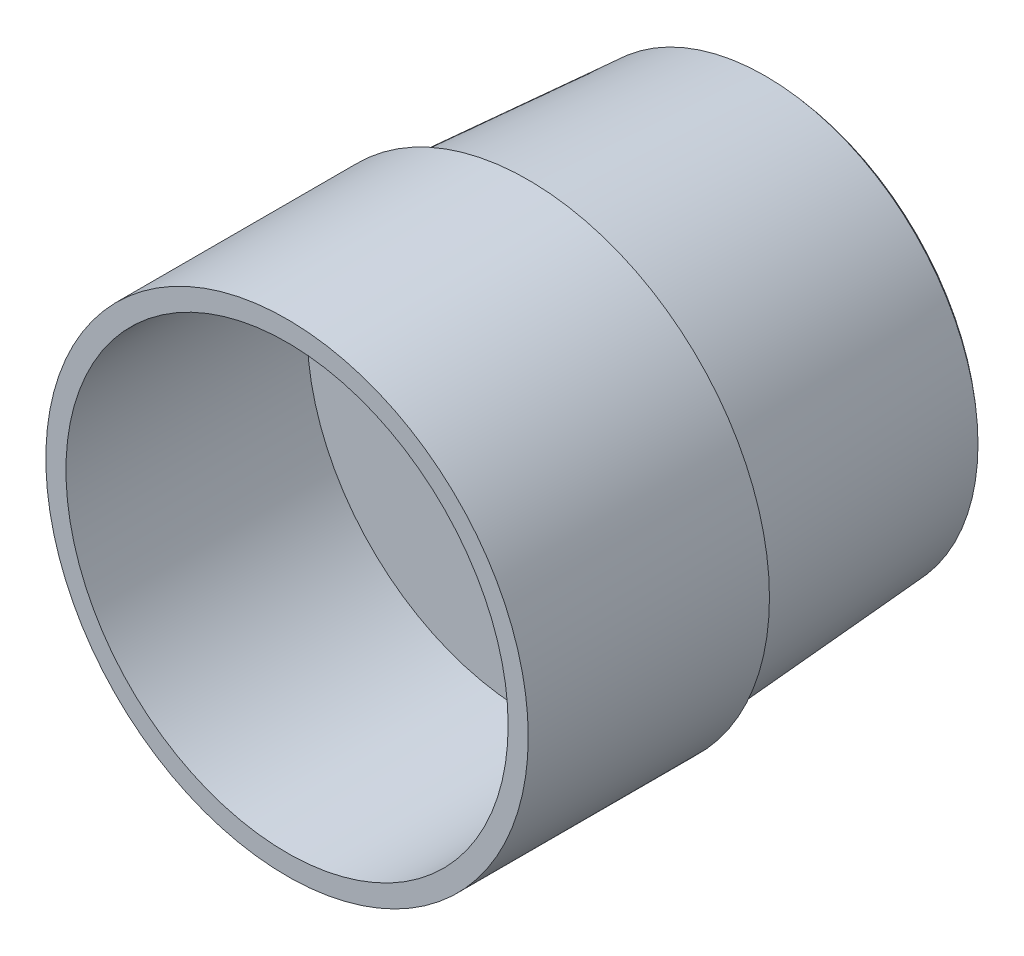
ISO-10303-21;
HEADER;
FILE_DESCRIPTION(('STEP AP214'),'2;1');
FILE_NAME('part.step','',(''),(''),'','','');
FILE_SCHEMA(('AUTOMOTIVE_DESIGN { 1 0 10303 214 1 1 1 1 }'));
ENDSEC;
DATA;
#1=APPLICATION_CONTEXT('core data for automotive mechanical design processes');
#2=APPLICATION_PROTOCOL_DEFINITION('international standard','automotive_design',2000,#1);
#3=PRODUCT_CONTEXT('',#1,'mechanical');
#4=PRODUCT('Part','Part','',(#3));
#5=PRODUCT_RELATED_PRODUCT_CATEGORY('part','',(#4));
#6=PRODUCT_DEFINITION_FORMATION('','',#4);
#7=PRODUCT_DEFINITION_CONTEXT('part definition',#1,'design');
#8=PRODUCT_DEFINITION('design','',#6,#7);
#9=PRODUCT_DEFINITION_SHAPE('','',#8);
#10=(LENGTH_UNIT() NAMED_UNIT(*) SI_UNIT(.MILLI.,.METRE.));
#11=(NAMED_UNIT(*) PLANE_ANGLE_UNIT() SI_UNIT($,.RADIAN.));
#12=(NAMED_UNIT(*) SI_UNIT($,.STERADIAN.) SOLID_ANGLE_UNIT());
#13=UNCERTAINTY_MEASURE_WITH_UNIT(LENGTH_MEASURE(1.E-05),#10,'distance_accuracy_value','');
#14=(GEOMETRIC_REPRESENTATION_CONTEXT(3) GLOBAL_UNCERTAINTY_ASSIGNED_CONTEXT((#13)) GLOBAL_UNIT_ASSIGNED_CONTEXT((#10,
#11,#12)) REPRESENTATION_CONTEXT('',''));
#15=CARTESIAN_POINT('',(0.,0.,0.));
#16=DIRECTION('',(0.,0.,1.));
#17=DIRECTION('',(1.,0.,0.));
#18=AXIS2_PLACEMENT_3D('',#15,#16,#17);
#19=CARTESIAN_POINT('',(0.,0.,12.));
#20=DIRECTION('',(0.,0.,1.));
#21=DIRECTION('',(1.,0.,0.));
#22=AXIS2_PLACEMENT_3D('',#19,#20,#21);
#23=PLANE('',#22);
#24=CARTESIAN_POINT('',(0.,0.,12.));
#25=DIRECTION('',(0.,0.,1.));
#26=DIRECTION('',(1.,0.,0.));
#27=AXIS2_PLACEMENT_3D('',#24,#25,#26);
#28=CIRCLE('',#27,12.);
#29=CARTESIAN_POINT('',(12.,0.,12.));
#30=VERTEX_POINT('',#29);
#31=EDGE_CURVE('E139',#30,#30,#28,.T.);
#32=ORIENTED_EDGE('',*,*,#31,.T.);
#33=EDGE_LOOP('',(#32));
#34=FACE_BOUND('',#33,.T.);
#35=CARTESIAN_POINT('',(0.,0.,12.));
#36=DIRECTION('',(0.,0.,1.));
#37=DIRECTION('',(1.,0.,0.));
#38=AXIS2_PLACEMENT_3D('',#35,#36,#37);
#39=CIRCLE('',#38,11.);
#40=CARTESIAN_POINT('',(11.,0.,12.));
#41=VERTEX_POINT('',#40);
#42=EDGE_CURVE('E131',#41,#41,#39,.T.);
#43=ORIENTED_EDGE('',*,*,#42,.F.);
#44=EDGE_LOOP('',(#43));
#45=FACE_BOUND('',#44,.T.);
#46=ADVANCED_FACE('F41',(#34,#45),#23,.T.);
#47=CARTESIAN_POINT('',(0.,0.,0.));
#48=DIRECTION('',(0.,0.,1.));
#49=DIRECTION('',(1.,0.,0.));
#50=AXIS2_PLACEMENT_3D('',#47,#48,#49);
#51=PLANE('',#50);
#52=CARTESIAN_POINT('',(0.,0.,0.));
#53=DIRECTION('',(0.,0.,1.));
#54=DIRECTION('',(1.,0.,0.));
#55=AXIS2_PLACEMENT_3D('',#52,#53,#54);
#56=CIRCLE('',#55,11.6);
#57=CARTESIAN_POINT('',(11.6,0.,0.));
#58=VERTEX_POINT('',#57);
#59=EDGE_CURVE('E154',#58,#58,#56,.T.);
#60=ORIENTED_EDGE('',*,*,#59,.T.);
#61=EDGE_LOOP('',(#60));
#62=FACE_BOUND('',#61,.T.);
#63=CARTESIAN_POINT('',(0.,0.,0.));
#64=DIRECTION('',(0.,0.,1.));
#65=DIRECTION('',(1.,0.,0.));
#66=AXIS2_PLACEMENT_3D('',#63,#64,#65);
#67=CIRCLE('',#66,12.);
#68=CARTESIAN_POINT('',(12.,0.,0.));
#69=VERTEX_POINT('',#68);
#70=EDGE_CURVE('E135',#69,#69,#67,.T.);
#71=ORIENTED_EDGE('',*,*,#70,.F.);
#72=EDGE_LOOP('',(#71));
#73=FACE_BOUND('',#72,.T.);
#74=ADVANCED_FACE('F229',(#62,#73),#51,.F.);
#75=CARTESIAN_POINT('',(0.,0.,12.));
#76=DIRECTION('',(0.,0.,-1.));
#77=DIRECTION('',(-1.,0.,0.));
#78=AXIS2_PLACEMENT_3D('',#75,#76,#77);
#79=CYLINDRICAL_SURFACE('',#78,12.);
#80=ORIENTED_EDGE('',*,*,#31,.F.);
#81=EDGE_LOOP('',(#80));
#82=FACE_BOUND('',#81,.T.);
#83=ORIENTED_EDGE('',*,*,#70,.T.);
#84=EDGE_LOOP('',(#83));
#85=FACE_BOUND('',#84,.T.);
#86=ADVANCED_FACE('F235',(#82,#85),#79,.T.);
#87=CARTESIAN_POINT('',(0.,0.,12.));
#88=DIRECTION('',(0.,0.,-1.));
#89=DIRECTION('',(-1.,0.,0.));
#90=AXIS2_PLACEMENT_3D('',#87,#88,#89);
#91=CYLINDRICAL_SURFACE('',#90,11.);
#92=ORIENTED_EDGE('',*,*,#42,.T.);
#93=EDGE_LOOP('',(#92));
#94=FACE_BOUND('',#93,.T.);
#95=CARTESIAN_POINT('',(0.,0.,0.));
#96=DIRECTION('',(0.,0.,1.));
#97=DIRECTION('',(1.,0.,0.));
#98=AXIS2_PLACEMENT_3D('',#95,#96,#97);
#99=CIRCLE('',#98,11.);
#100=CARTESIAN_POINT('',(11.,0.,0.));
#101=VERTEX_POINT('',#100);
#102=EDGE_CURVE('E102',#101,#101,#99,.T.);
#103=ORIENTED_EDGE('',*,*,#102,.F.);
#104=EDGE_LOOP('',(#103));
#105=FACE_BOUND('',#104,.T.);
#106=ADVANCED_FACE('F240',(#94,#105),#91,.F.);
#107=CARTESIAN_POINT('',(0.,0.,0.));
#108=DIRECTION('',(0.,0.,-1.));
#109=DIRECTION('',(-1.,0.,0.));
#110=AXIS2_PLACEMENT_3D('',#107,#108,#109);
#111=PLANE('',#110);
#112=ORIENTED_EDGE('',*,*,#102,.T.);
#113=EDGE_LOOP('',(#112));
#114=FACE_BOUND('',#113,.T.);
#115=ADVANCED_FACE('F353',(#114),#111,.F.);
#116=CARTESIAN_POINT('',(0.,0.,0.));
#117=DIRECTION('',(0.,0.,1.));
#118=DIRECTION('',(-1.,0.,0.));
#119=AXIS2_PLACEMENT_3D('',#116,#117,#118);
#120=CONICAL_SURFACE('',#119,11.4,0.0698131700797733);
#121=CARTESIAN_POINT('',(0.,0.,-0.215036840722106));
#122=DIRECTION('',(0.,0.,1.));
#123=DIRECTION('',(1.,0.,0.));
#124=AXIS2_PLACEMENT_3D('',#121,#122,#123);
#125=CIRCLE('',#124,11.3849631592779);
#126=CARTESIAN_POINT('',(11.3849631592779,0.,-0.215036840722106));
#127=VERTEX_POINT('',#126);
#128=EDGE_CURVE('E150',#127,#127,#125,.F.);
#129=ORIENTED_EDGE('',*,*,#128,.T.);
#130=EDGE_LOOP('',(#129));
#131=FACE_BOUND('',#130,.T.);
#132=CARTESIAN_POINT('',(0.,0.,-11.800487189948));
#133=DIRECTION('',(0.,0.,1.));
#134=DIRECTION('',(1.,0.,0.));
#135=AXIS2_PLACEMENT_3D('',#132,#133,#134);
#136=CIRCLE('',#135,10.5748295514267);
#137=CARTESIAN_POINT('',(10.5748295514267,0.,-11.800487189948));
#138=VERTEX_POINT('',#137);
#139=EDGE_CURVE('E143',#138,#138,#136,.T.);
#140=ORIENTED_EDGE('',*,*,#139,.T.);
#141=EDGE_LOOP('',(#140));
#142=FACE_BOUND('',#141,.T.);
#143=ADVANCED_FACE('F345',(#131,#142),#120,.T.);
#144=CARTESIAN_POINT('',(0.,0.,-12.));
#145=DIRECTION('',(0.,0.,-1.));
#146=DIRECTION('',(-1.,0.,0.));
#147=AXIS2_PLACEMENT_3D('',#144,#145,#146);
#148=PLANE('',#147);
#149=DIRECTION('',(0.,-1.,0.));
#150=VECTOR('',#149,1.);
#151=CARTESIAN_POINT('',(-1.6,-7.,-12.));
#152=LINE('',#151,#150);
#153=CARTESIAN_POINT('',(-1.6,7.2,-12.));
#154=VERTEX_POINT('',#153);
#155=CARTESIAN_POINT('',(-1.6,-7.2,-12.));
#156=VERTEX_POINT('',#155);
#157=EDGE_CURVE('E166',#154,#156,#152,.T.);
#158=ORIENTED_EDGE('',*,*,#157,.T.);
#159=DIRECTION('',(1.,0.,0.));
#160=VECTOR('',#159,1.);
#161=CARTESIAN_POINT('',(1.4,-7.2,-12.));
#162=LINE('',#161,#160);
#163=CARTESIAN_POINT('',(1.6,-7.2,-12.));
#164=VERTEX_POINT('',#163);
#165=EDGE_CURVE('E175',#156,#164,#162,.T.);
#166=ORIENTED_EDGE('',*,*,#165,.T.);
#167=DIRECTION('',(0.,1.,0.));
#168=VECTOR('',#167,1.);
#169=CARTESIAN_POINT('',(1.6,7.,-12.));
#170=LINE('',#169,#168);
#171=CARTESIAN_POINT('',(1.6,7.2,-12.));
#172=VERTEX_POINT('',#171);
#173=EDGE_CURVE('E172',#164,#172,#170,.T.);
#174=ORIENTED_EDGE('',*,*,#173,.T.);
#175=DIRECTION('',(-1.,0.,0.));
#176=VECTOR('',#175,1.);
#177=CARTESIAN_POINT('',(-1.4,7.2,-12.));
#178=LINE('',#177,#176);
#179=EDGE_CURVE('E169',#172,#154,#178,.T.);
#180=ORIENTED_EDGE('',*,*,#179,.T.);
#181=EDGE_LOOP('',(#158,#166,#174,#180));
#182=FACE_BOUND('',#181,.T.);
#183=CARTESIAN_POINT('',(0.,0.,-12.));
#184=DIRECTION('',(0.,0.,-1.));
#185=DIRECTION('',(-1.,0.,0.));
#186=AXIS2_PLACEMENT_3D('',#183,#184,#185);
#187=CIRCLE('',#186,10.345316317907);
#188=CARTESIAN_POINT('',(-10.345316317907,0.,-12.));
#189=VERTEX_POINT('',#188);
#190=EDGE_CURVE('E162',#189,#189,#187,.T.);
#191=ORIENTED_EDGE('',*,*,#190,.T.);
#192=EDGE_LOOP('',(#191));
#193=FACE_BOUND('',#192,.T.);
#194=ADVANCED_FACE('F206',(#182,#193),#148,.T.);
#195=CARTESIAN_POINT('',(1.4,7.,-12.));
#196=DIRECTION('',(0.996194698091746,0.,0.0871557427476584));
#197=DIRECTION('',(0.0871557427476584,0.,-0.996194698091746));
#198=AXIS2_PLACEMENT_3D('',#195,#196,#197);
#199=PLANE('',#198);
#200=DIRECTION('',(0.0868265938642478,0.0868265938642478,-0.992432509138967));
#201=VECTOR('',#200,1.);
#202=CARTESIAN_POINT('',(1.4,7.,-12.));
#203=LINE('',#202,#201);
#204=CARTESIAN_POINT('',(0.700090691792606,6.30009069179261,-4.));
#205=VERTEX_POINT('',#204);
#206=CARTESIAN_POINT('',(1.38082464074058,6.98082464074058,-11.7808246407406));
#207=VERTEX_POINT('',#206);
#208=EDGE_CURVE('E94',#205,#207,#203,.T.);
#209=ORIENTED_EDGE('',*,*,#208,.T.);
#210=DIRECTION('',(0.,-1.,0.));
#211=VECTOR('',#210,1.);
#212=CARTESIAN_POINT('',(1.38082464074058,-7.,-11.7808246407406));
#213=LINE('',#212,#211);
#214=CARTESIAN_POINT('',(1.38082464074058,-6.98082464074058,-11.7808246407406));
#215=VERTEX_POINT('',#214);
#216=EDGE_CURVE('E179',#207,#215,#213,.T.);
#217=ORIENTED_EDGE('',*,*,#216,.T.);
#218=DIRECTION('',(0.0868265938642478,-0.0868265938642478,-0.992432509138967));
#219=VECTOR('',#218,1.);
#220=CARTESIAN_POINT('',(1.29445599637106,-6.89445599637106,-10.7936265182784));
#221=LINE('',#220,#219);
#222=CARTESIAN_POINT('',(0.700090691792607,-6.30009069179261,-4.));
#223=VERTEX_POINT('',#222);
#224=EDGE_CURVE('E109',#223,#215,#221,.T.);
#225=ORIENTED_EDGE('',*,*,#224,.F.);
#226=DIRECTION('',(0.,-1.,0.));
#227=VECTOR('',#226,1.);
#228=CARTESIAN_POINT('',(0.700090691792607,0.,-4.));
#229=LINE('',#228,#227);
#230=EDGE_CURVE('E106',#205,#223,#229,.T.);
#231=ORIENTED_EDGE('',*,*,#230,.F.);
#232=EDGE_LOOP('',(#209,#217,#225,#231));
#233=FACE_BOUND('',#232,.T.);
#234=ADVANCED_FACE('F107',(#233),#199,.F.);
#235=CARTESIAN_POINT('',(1.4,7.,-12.));
#236=DIRECTION('',(0.,0.996194698091746,0.0871557427476584));
#237=DIRECTION('',(0.,-0.0871557427476584,0.996194698091746));
#238=AXIS2_PLACEMENT_3D('',#235,#236,#237);
#239=PLANE('',#238);
#240=DIRECTION('',(-0.0868265938642478,0.0868265938642478,-0.992432509138967));
#241=VECTOR('',#240,1.);
#242=CARTESIAN_POINT('',(-1.4,7.,-12.));
#243=LINE('',#242,#241);
#244=CARTESIAN_POINT('',(-0.700090691792607,6.30009069179261,-4.));
#245=VERTEX_POINT('',#244);
#246=CARTESIAN_POINT('',(-1.38082464074058,6.98082464074058,-11.7808246407406));
#247=VERTEX_POINT('',#246);
#248=EDGE_CURVE('E103',#245,#247,#243,.T.);
#249=ORIENTED_EDGE('',*,*,#248,.T.);
#250=DIRECTION('',(1.,0.,0.));
#251=VECTOR('',#250,1.);
#252=CARTESIAN_POINT('',(1.4,6.98082464074058,-11.7808246407406));
#253=LINE('',#252,#251);
#254=EDGE_CURVE('E52',#247,#207,#253,.T.);
#255=ORIENTED_EDGE('',*,*,#254,.T.);
#256=ORIENTED_EDGE('',*,*,#208,.F.);
#257=DIRECTION('',(1.,0.,0.));
#258=VECTOR('',#257,1.);
#259=CARTESIAN_POINT('',(0.,6.30009069179261,-4.));
#260=LINE('',#259,#258);
#261=EDGE_CURVE('E98',#245,#205,#260,.T.);
#262=ORIENTED_EDGE('',*,*,#261,.F.);
#263=EDGE_LOOP('',(#249,#255,#256,#262));
#264=FACE_BOUND('',#263,.T.);
#265=ADVANCED_FACE('F96',(#264),#239,.F.);
#266=CARTESIAN_POINT('',(-1.4,7.,-12.));
#267=DIRECTION('',(-0.996194698091746,0.,0.0871557427476584));
#268=DIRECTION('',(0.0871557427476584,0.,0.996194698091746));
#269=AXIS2_PLACEMENT_3D('',#266,#267,#268);
#270=PLANE('',#269);
#271=DIRECTION('',(-0.0868265938642478,-0.0868265938642478,-0.992432509138967));
#272=VECTOR('',#271,1.);
#273=CARTESIAN_POINT('',(-1.37889119927421,-6.97889119927421,-11.7587253036557));
#274=LINE('',#273,#272);
#275=CARTESIAN_POINT('',(-0.700090691792607,-6.30009069179261,-4.));
#276=VERTEX_POINT('',#275);
#277=CARTESIAN_POINT('',(-1.38082464074058,-6.98082464074058,-11.7808246407406));
#278=VERTEX_POINT('',#277);
#279=EDGE_CURVE('E124',#276,#278,#274,.T.);
#280=ORIENTED_EDGE('',*,*,#279,.T.);
#281=DIRECTION('',(0.,1.,0.));
#282=VECTOR('',#281,1.);
#283=CARTESIAN_POINT('',(-1.38082464074058,7.,-11.7808246407406));
#284=LINE('',#283,#282);
#285=EDGE_CURVE('E11',#278,#247,#284,.T.);
#286=ORIENTED_EDGE('',*,*,#285,.T.);
#287=ORIENTED_EDGE('',*,*,#248,.F.);
#288=DIRECTION('',(0.,1.,0.));
#289=VECTOR('',#288,1.);
#290=CARTESIAN_POINT('',(-0.700090691792607,0.,-4.));
#291=LINE('',#290,#289);
#292=EDGE_CURVE('E119',#276,#245,#291,.T.);
#293=ORIENTED_EDGE('',*,*,#292,.F.);
#294=EDGE_LOOP('',(#280,#286,#287,#293));
#295=FACE_BOUND('',#294,.T.);
#296=ADVANCED_FACE('F216',(#295),#270,.F.);
#297=CARTESIAN_POINT('',(1.4,-7.,-12.));
#298=DIRECTION('',(0.,-0.996194698091746,0.0871557427476584));
#299=DIRECTION('',(0.,-0.0871557427476584,-0.996194698091746));
#300=AXIS2_PLACEMENT_3D('',#297,#298,#299);
#301=PLANE('',#300);
#302=ORIENTED_EDGE('',*,*,#224,.T.);
#303=DIRECTION('',(-1.,0.,0.));
#304=VECTOR('',#303,1.);
#305=CARTESIAN_POINT('',(-1.4,-6.98082464074058,-11.7808246407406));
#306=LINE('',#305,#304);
#307=EDGE_CURVE('E158',#215,#278,#306,.T.);
#308=ORIENTED_EDGE('',*,*,#307,.T.);
#309=ORIENTED_EDGE('',*,*,#279,.F.);
#310=DIRECTION('',(-1.,0.,0.));
#311=VECTOR('',#310,1.);
#312=CARTESIAN_POINT('',(0.,-6.30009069179261,-4.));
#313=LINE('',#312,#311);
#314=EDGE_CURVE('E114',#223,#276,#313,.T.);
#315=ORIENTED_EDGE('',*,*,#314,.F.);
#316=EDGE_LOOP('',(#302,#308,#309,#315));
#317=FACE_BOUND('',#316,.T.);
#318=ADVANCED_FACE('F215',(#317),#301,.F.);
#319=CARTESIAN_POINT('',(0.,0.,-4.));
#320=DIRECTION('',(0.,0.,-1.));
#321=DIRECTION('',(-1.,0.,0.));
#322=AXIS2_PLACEMENT_3D('',#319,#320,#321);
#323=PLANE('',#322);
#324=ORIENTED_EDGE('',*,*,#230,.T.);
#325=ORIENTED_EDGE('',*,*,#314,.T.);
#326=ORIENTED_EDGE('',*,*,#292,.T.);
#327=ORIENTED_EDGE('',*,*,#261,.T.);
#328=EDGE_LOOP('',(#324,#325,#326,#327));
#329=FACE_BOUND('',#328,.T.);
#330=ADVANCED_FACE('F117',(#329),#323,.T.);
#331=CARTESIAN_POINT('',(0.,0.,-0.215036840722107));
#332=DIRECTION('',(0.,0.,1.));
#333=DIRECTION('',(1.,0.,0.));
#334=AXIS2_PLACEMENT_3D('',#331,#332,#333);
#335=CONICAL_SURFACE('',#334,11.3849631592779,0.785398163397442);
#336=ORIENTED_EDGE('',*,*,#59,.F.);
#337=EDGE_LOOP('',(#336));
#338=FACE_BOUND('',#337,.T.);
#339=ORIENTED_EDGE('',*,*,#128,.F.);
#340=EDGE_LOOP('',(#339));
#341=FACE_BOUND('',#340,.T.);
#342=ADVANCED_FACE('F247',(#338,#341),#335,.T.);
#343=CARTESIAN_POINT('',(1.4,6.98082464074058,-11.7808246407406));
#344=DIRECTION('',(0.,-0.707106781186546,-0.707106781186549));
#345=DIRECTION('',(-1.,0.,0.));
#346=AXIS2_PLACEMENT_3D('',#343,#344,#345);
#347=PLANE('',#346);
#348=DIRECTION('',(0.577350269189625,-0.577350269189628,0.577350269189625));
#349=VECTOR('',#348,1.);
#350=CARTESIAN_POINT('',(-0.453883093827057,6.05388309382705,-10.8538830938271));
#351=LINE('',#350,#349);
#352=EDGE_CURVE('E189',#154,#247,#351,.T.);
#353=ORIENTED_EDGE('',*,*,#352,.F.);
#354=ORIENTED_EDGE('',*,*,#179,.F.);
#355=DIRECTION('',(-0.577350269189625,-0.577350269189627,0.577350269189625));
#356=VECTOR('',#355,1.);
#357=CARTESIAN_POINT('',(1.38721642716039,6.98721642716039,-11.7872164271604));
#358=LINE('',#357,#356);
#359=EDGE_CURVE('E46',#207,#172,#358,.F.);
#360=ORIENTED_EDGE('',*,*,#359,.F.);
#361=ORIENTED_EDGE('',*,*,#254,.F.);
#362=EDGE_LOOP('',(#353,#354,#360,#361));
#363=FACE_BOUND('',#362,.T.);
#364=ADVANCED_FACE('F204',(#363),#347,.T.);
#365=CARTESIAN_POINT('',(1.38082464074058,7.,-11.7808246407406));
#366=DIRECTION('',(-0.707106781186548,0.,-0.707106781186547));
#367=DIRECTION('',(0.,1.,0.));
#368=AXIS2_PLACEMENT_3D('',#365,#366,#367);
#369=PLANE('',#368);
#370=ORIENTED_EDGE('',*,*,#359,.T.);
#371=ORIENTED_EDGE('',*,*,#173,.F.);
#372=DIRECTION('',(-0.577350269189625,0.577350269189628,0.577350269189625));
#373=VECTOR('',#372,1.);
#374=CARTESIAN_POINT('',(1.38721642716039,-6.98721642716039,-11.7872164271604));
#375=LINE('',#374,#373);
#376=EDGE_CURVE('E187',#215,#164,#375,.F.);
#377=ORIENTED_EDGE('',*,*,#376,.F.);
#378=ORIENTED_EDGE('',*,*,#216,.F.);
#379=EDGE_LOOP('',(#370,#371,#377,#378));
#380=FACE_BOUND('',#379,.T.);
#381=ADVANCED_FACE('F200',(#380),#369,.T.);
#382=CARTESIAN_POINT('',(-1.38082464074058,7.,-11.7808246407406));
#383=DIRECTION('',(0.707106781186548,0.,-0.707106781186547));
#384=DIRECTION('',(0.,-1.,0.));
#385=AXIS2_PLACEMENT_3D('',#382,#383,#384);
#386=PLANE('',#385);
#387=ORIENTED_EDGE('',*,*,#352,.T.);
#388=ORIENTED_EDGE('',*,*,#285,.F.);
#389=DIRECTION('',(-0.577350269189625,-0.577350269189628,-0.577350269189625));
#390=VECTOR('',#389,1.);
#391=CARTESIAN_POINT('',(-0.453883093827056,-6.05388309382705,-10.8538830938271));
#392=LINE('',#391,#390);
#393=EDGE_CURVE('E184',#156,#278,#392,.F.);
#394=ORIENTED_EDGE('',*,*,#393,.F.);
#395=ORIENTED_EDGE('',*,*,#157,.F.);
#396=EDGE_LOOP('',(#387,#388,#394,#395));
#397=FACE_BOUND('',#396,.T.);
#398=ADVANCED_FACE('F213',(#397),#386,.T.);
#399=CARTESIAN_POINT('',(1.4,-6.98082464074058,-11.7808246407406));
#400=DIRECTION('',(0.,0.707106781186546,-0.707106781186549));
#401=DIRECTION('',(1.,0.,0.));
#402=AXIS2_PLACEMENT_3D('',#399,#400,#401);
#403=PLANE('',#402);
#404=ORIENTED_EDGE('',*,*,#376,.T.);
#405=ORIENTED_EDGE('',*,*,#165,.F.);
#406=ORIENTED_EDGE('',*,*,#393,.T.);
#407=ORIENTED_EDGE('',*,*,#307,.F.);
#408=EDGE_LOOP('',(#404,#405,#406,#407));
#409=FACE_BOUND('',#408,.T.);
#410=ADVANCED_FACE('F211',(#409),#403,.T.);
#411=CARTESIAN_POINT('',(0.,0.,-12.));
#412=DIRECTION('',(0.,0.,1.));
#413=DIRECTION('',(1.,0.,0.));
#414=AXIS2_PLACEMENT_3D('',#411,#412,#413);
#415=CONICAL_SURFACE('',#414,10.345316317907,0.855211333477219);
#416=ORIENTED_EDGE('',*,*,#139,.F.);
#417=EDGE_LOOP('',(#416));
#418=FACE_BOUND('',#417,.T.);
#419=ORIENTED_EDGE('',*,*,#190,.F.);
#420=EDGE_LOOP('',(#419));
#421=FACE_BOUND('',#420,.T.);
#422=ADVANCED_FACE('F44',(#418,#421),#415,.T.);
#423=CLOSED_SHELL('',(#46,#74,#86,#106,#115,#143,#194,#234,#265,#296,#318,#330,#342,#364,#381,
#398,#410,#422));
#424=MANIFOLD_SOLID_BREP('B2',#423);
#425=ADVANCED_BREP_SHAPE_REPRESENTATION('',(#18,#424),#14);
#426=SHAPE_DEFINITION_REPRESENTATION(#9,#425);
ENDSEC;
END-ISO-10303-21;
